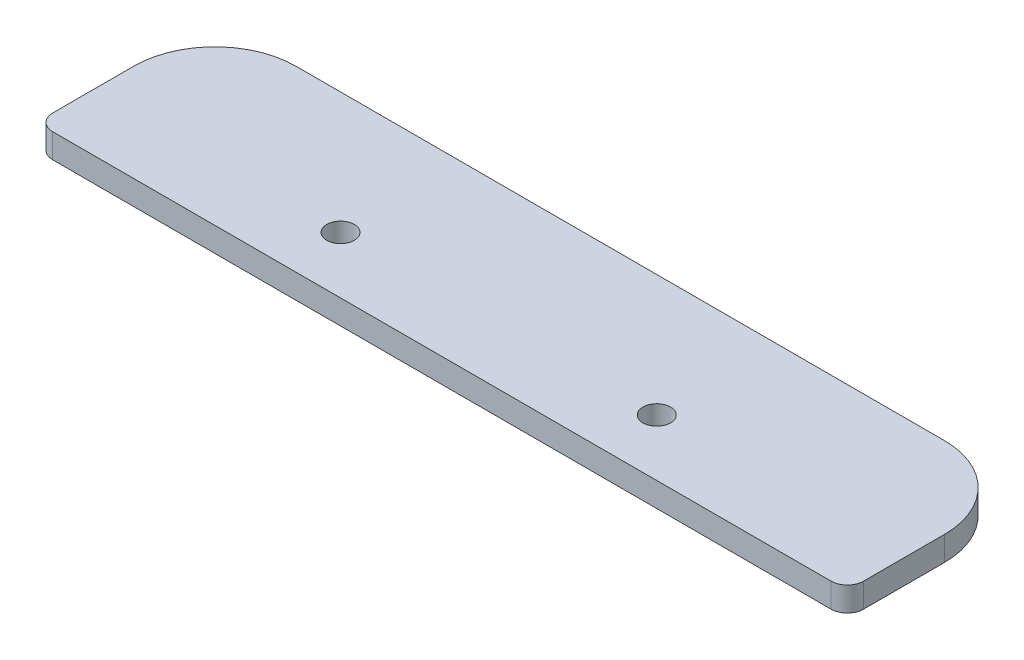
ISO-10303-21;
HEADER;
FILE_DESCRIPTION(('STEP AP214'),'2;1');
FILE_NAME('part.step','',(''),(''),'','','');
FILE_SCHEMA(('AUTOMOTIVE_DESIGN { 1 0 10303 214 1 1 1 1 }'));
ENDSEC;
DATA;
#1=APPLICATION_CONTEXT('core data for automotive mechanical design processes');
#2=APPLICATION_PROTOCOL_DEFINITION('international standard','automotive_design',2000,#1);
#3=PRODUCT_CONTEXT('',#1,'mechanical');
#4=PRODUCT('Part','Part','',(#3));
#5=PRODUCT_RELATED_PRODUCT_CATEGORY('part','',(#4));
#6=PRODUCT_DEFINITION_FORMATION('','',#4);
#7=PRODUCT_DEFINITION_CONTEXT('part definition',#1,'design');
#8=PRODUCT_DEFINITION('design','',#6,#7);
#9=PRODUCT_DEFINITION_SHAPE('','',#8);
#10=(LENGTH_UNIT() NAMED_UNIT(*) SI_UNIT(.MILLI.,.METRE.));
#11=(NAMED_UNIT(*) PLANE_ANGLE_UNIT() SI_UNIT($,.RADIAN.));
#12=(NAMED_UNIT(*) SI_UNIT($,.STERADIAN.) SOLID_ANGLE_UNIT());
#13=UNCERTAINTY_MEASURE_WITH_UNIT(LENGTH_MEASURE(1.E-05),#10,'distance_accuracy_value','');
#14=(GEOMETRIC_REPRESENTATION_CONTEXT(3) GLOBAL_UNCERTAINTY_ASSIGNED_CONTEXT((#13)) GLOBAL_UNIT_ASSIGNED_CONTEXT((#10,
#11,#12)) REPRESENTATION_CONTEXT('',''));
#15=CARTESIAN_POINT('',(0.,0.,0.));
#16=DIRECTION('',(0.,0.,1.));
#17=DIRECTION('',(1.,0.,0.));
#18=AXIS2_PLACEMENT_3D('',#15,#16,#17);
#19=CARTESIAN_POINT('',(-50.,15.,-50.));
#20=DIRECTION('',(1.,0.,0.));
#21=DIRECTION('',(0.,0.,-1.));
#22=AXIS2_PLACEMENT_3D('',#19,#20,#21);
#23=PLANE('',#22);
#24=DIRECTION('',(0.,0.,1.));
#25=VECTOR('',#24,1.);
#26=CARTESIAN_POINT('',(-50.,12.,-50.));
#27=LINE('',#26,#25);
#28=CARTESIAN_POINT('',(-50.,12.,-40.));
#29=VERTEX_POINT('',#28);
#30=CARTESIAN_POINT('',(-50.,12.,-30.));
#31=VERTEX_POINT('',#30);
#32=EDGE_CURVE('E119',#29,#31,#27,.T.);
#33=ORIENTED_EDGE('',*,*,#32,.T.);
#34=DIRECTION('',(0.,-1.,0.));
#35=VECTOR('',#34,1.);
#36=CARTESIAN_POINT('',(-50.,15.,-30.));
#37=LINE('',#36,#35);
#38=CARTESIAN_POINT('',(-50.,15.,-30.));
#39=VERTEX_POINT('',#38);
#40=EDGE_CURVE('E65',#31,#39,#37,.F.);
#41=ORIENTED_EDGE('',*,*,#40,.T.);
#42=DIRECTION('',(0.,0.,1.));
#43=VECTOR('',#42,1.);
#44=CARTESIAN_POINT('',(-50.,15.,-50.));
#45=LINE('',#44,#43);
#46=CARTESIAN_POINT('',(-50.,15.,-40.));
#47=VERTEX_POINT('',#46);
#48=EDGE_CURVE('E122',#47,#39,#45,.T.);
#49=ORIENTED_EDGE('',*,*,#48,.F.);
#50=DIRECTION('',(0.,-1.,0.));
#51=VECTOR('',#50,1.);
#52=CARTESIAN_POINT('',(-50.,15.,-40.));
#53=LINE('',#52,#51);
#54=EDGE_CURVE('E111',#47,#29,#53,.T.);
#55=ORIENTED_EDGE('',*,*,#54,.T.);
#56=EDGE_LOOP('',(#33,#41,#49,#55));
#57=FACE_BOUND('',#56,.T.);
#58=ADVANCED_FACE('F39',(#57),#23,.F.);
#59=CARTESIAN_POINT('',(-50.,15.,-28.));
#60=DIRECTION('',(0.,0.,-1.));
#61=DIRECTION('',(-1.,0.,0.));
#62=AXIS2_PLACEMENT_3D('',#59,#60,#61);
#63=PLANE('',#62);
#64=DIRECTION('',(1.,0.,0.));
#65=VECTOR('',#64,1.);
#66=CARTESIAN_POINT('',(-50.,15.,-28.));
#67=LINE('',#66,#65);
#68=CARTESIAN_POINT('',(-48.,15.,-28.));
#69=VERTEX_POINT('',#68);
#70=CARTESIAN_POINT('',(48.,15.,-28.));
#71=VERTEX_POINT('',#70);
#72=EDGE_CURVE('E168',#69,#71,#67,.T.);
#73=ORIENTED_EDGE('',*,*,#72,.F.);
#74=DIRECTION('',(0.,-1.,0.));
#75=VECTOR('',#74,1.);
#76=CARTESIAN_POINT('',(-48.,15.,-28.));
#77=LINE('',#76,#75);
#78=CARTESIAN_POINT('',(-48.,12.,-28.));
#79=VERTEX_POINT('',#78);
#80=EDGE_CURVE('E156',#69,#79,#77,.T.);
#81=ORIENTED_EDGE('',*,*,#80,.T.);
#82=DIRECTION('',(1.,0.,0.));
#83=VECTOR('',#82,1.);
#84=CARTESIAN_POINT('',(-50.,12.,-28.));
#85=LINE('',#84,#83);
#86=CARTESIAN_POINT('',(48.,12.,-28.));
#87=VERTEX_POINT('',#86);
#88=EDGE_CURVE('E130',#79,#87,#85,.T.);
#89=ORIENTED_EDGE('',*,*,#88,.T.);
#90=DIRECTION('',(0.,-1.,0.));
#91=VECTOR('',#90,1.);
#92=CARTESIAN_POINT('',(48.,15.,-28.));
#93=LINE('',#92,#91);
#94=EDGE_CURVE('E153',#87,#71,#93,.F.);
#95=ORIENTED_EDGE('',*,*,#94,.T.);
#96=EDGE_LOOP('',(#73,#81,#89,#95));
#97=FACE_BOUND('',#96,.T.);
#98=ADVANCED_FACE('F167',(#97),#63,.F.);
#99=CARTESIAN_POINT('',(50.,15.,-50.));
#100=DIRECTION('',(-1.,0.,0.));
#101=DIRECTION('',(0.,0.,1.));
#102=AXIS2_PLACEMENT_3D('',#99,#100,#101);
#103=PLANE('',#102);
#104=DIRECTION('',(0.,0.,-1.));
#105=VECTOR('',#104,1.);
#106=CARTESIAN_POINT('',(50.,15.,-50.));
#107=LINE('',#106,#105);
#108=CARTESIAN_POINT('',(50.,15.,-30.));
#109=VERTEX_POINT('',#108);
#110=CARTESIAN_POINT('',(50.,15.,-40.));
#111=VERTEX_POINT('',#110);
#112=EDGE_CURVE('E175',#109,#111,#107,.T.);
#113=ORIENTED_EDGE('',*,*,#112,.F.);
#114=DIRECTION('',(0.,-1.,0.));
#115=VECTOR('',#114,1.);
#116=CARTESIAN_POINT('',(50.,15.,-30.));
#117=LINE('',#116,#115);
#118=CARTESIAN_POINT('',(50.,12.,-30.));
#119=VERTEX_POINT('',#118);
#120=EDGE_CURVE('E11',#109,#119,#117,.T.);
#121=ORIENTED_EDGE('',*,*,#120,.T.);
#122=DIRECTION('',(0.,0.,-1.));
#123=VECTOR('',#122,1.);
#124=CARTESIAN_POINT('',(50.,12.,-50.));
#125=LINE('',#124,#123);
#126=CARTESIAN_POINT('',(50.,12.,-40.));
#127=VERTEX_POINT('',#126);
#128=EDGE_CURVE('E131',#119,#127,#125,.T.);
#129=ORIENTED_EDGE('',*,*,#128,.T.);
#130=DIRECTION('',(0.,-1.,0.));
#131=VECTOR('',#130,1.);
#132=CARTESIAN_POINT('',(50.,15.,-40.));
#133=LINE('',#132,#131);
#134=EDGE_CURVE('E151',#127,#111,#133,.F.);
#135=ORIENTED_EDGE('',*,*,#134,.T.);
#136=EDGE_LOOP('',(#113,#121,#129,#135));
#137=FACE_BOUND('',#136,.T.);
#138=ADVANCED_FACE('F188',(#137),#103,.F.);
#139=CARTESIAN_POINT('',(-50.,15.,-50.));
#140=DIRECTION('',(0.,0.,1.));
#141=DIRECTION('',(1.,0.,0.));
#142=AXIS2_PLACEMENT_3D('',#139,#140,#141);
#143=PLANE('',#142);
#144=DIRECTION('',(-1.,0.,0.));
#145=VECTOR('',#144,1.);
#146=CARTESIAN_POINT('',(-50.,12.,-50.));
#147=LINE('',#146,#145);
#148=CARTESIAN_POINT('',(40.,12.,-50.));
#149=VERTEX_POINT('',#148);
#150=CARTESIAN_POINT('',(-40.,12.,-50.));
#151=VERTEX_POINT('',#150);
#152=EDGE_CURVE('E140',#149,#151,#147,.T.);
#153=ORIENTED_EDGE('',*,*,#152,.T.);
#154=DIRECTION('',(0.,-1.,0.));
#155=VECTOR('',#154,1.);
#156=CARTESIAN_POINT('',(-40.,15.,-50.));
#157=LINE('',#156,#155);
#158=CARTESIAN_POINT('',(-40.,15.,-50.));
#159=VERTEX_POINT('',#158);
#160=EDGE_CURVE('E115',#151,#159,#157,.F.);
#161=ORIENTED_EDGE('',*,*,#160,.T.);
#162=DIRECTION('',(-1.,0.,0.));
#163=VECTOR('',#162,1.);
#164=CARTESIAN_POINT('',(-50.,15.,-50.));
#165=LINE('',#164,#163);
#166=CARTESIAN_POINT('',(40.,15.,-50.));
#167=VERTEX_POINT('',#166);
#168=EDGE_CURVE('E125',#167,#159,#165,.T.);
#169=ORIENTED_EDGE('',*,*,#168,.F.);
#170=DIRECTION('',(0.,-1.,0.));
#171=VECTOR('',#170,1.);
#172=CARTESIAN_POINT('',(40.,15.,-50.));
#173=LINE('',#172,#171);
#174=EDGE_CURVE('E120',#167,#149,#173,.T.);
#175=ORIENTED_EDGE('',*,*,#174,.T.);
#176=EDGE_LOOP('',(#153,#161,#169,#175));
#177=FACE_BOUND('',#176,.T.);
#178=ADVANCED_FACE('F215',(#177),#143,.F.);
#179=CARTESIAN_POINT('',(0.,15.,0.));
#180=DIRECTION('',(0.,1.,0.));
#181=DIRECTION('',(0.,0.,1.));
#182=AXIS2_PLACEMENT_3D('',#179,#180,#181);
#183=PLANE('',#182);
#184=CARTESIAN_POINT('',(-19.5,15.,-35.));
#185=DIRECTION('',(0.,1.,0.));
#186=DIRECTION('',(0.,0.,1.));
#187=AXIS2_PLACEMENT_3D('',#184,#185,#186);
#188=CIRCLE('',#187,1.7);
#189=CARTESIAN_POINT('',(-19.5,15.,-33.3));
#190=VERTEX_POINT('',#189);
#191=EDGE_CURVE('E133',#190,#190,#188,.T.);
#192=ORIENTED_EDGE('',*,*,#191,.F.);
#193=EDGE_LOOP('',(#192));
#194=FACE_BOUND('',#193,.T.);
#195=CARTESIAN_POINT('',(19.5,15.,-35.));
#196=DIRECTION('',(0.,1.,0.));
#197=DIRECTION('',(0.,0.,1.));
#198=AXIS2_PLACEMENT_3D('',#195,#196,#197);
#199=CIRCLE('',#198,1.7);
#200=CARTESIAN_POINT('',(19.5,15.,-33.3));
#201=VERTEX_POINT('',#200);
#202=EDGE_CURVE('E229',#201,#201,#199,.T.);
#203=ORIENTED_EDGE('',*,*,#202,.F.);
#204=EDGE_LOOP('',(#203));
#205=FACE_BOUND('',#204,.T.);
#206=ORIENTED_EDGE('',*,*,#48,.T.);
#207=CARTESIAN_POINT('',(-48.,15.,-30.));
#208=DIRECTION('',(0.,1.,0.));
#209=DIRECTION('',(0.,0.,1.));
#210=AXIS2_PLACEMENT_3D('',#207,#208,#209);
#211=CIRCLE('',#210,2.);
#212=EDGE_CURVE('E50',#39,#69,#211,.T.);
#213=ORIENTED_EDGE('',*,*,#212,.T.);
#214=ORIENTED_EDGE('',*,*,#72,.T.);
#215=CARTESIAN_POINT('',(48.,15.,-30.));
#216=DIRECTION('',(0.,1.,0.));
#217=DIRECTION('',(0.,0.,1.));
#218=AXIS2_PLACEMENT_3D('',#215,#216,#217);
#219=CIRCLE('',#218,2.);
#220=EDGE_CURVE('E53',#71,#109,#219,.T.);
#221=ORIENTED_EDGE('',*,*,#220,.T.);
#222=ORIENTED_EDGE('',*,*,#112,.T.);
#223=CARTESIAN_POINT('',(40.,15.,-40.));
#224=DIRECTION('',(0.,1.,0.));
#225=DIRECTION('',(0.,0.,1.));
#226=AXIS2_PLACEMENT_3D('',#223,#224,#225);
#227=CIRCLE('',#226,10.);
#228=EDGE_CURVE('E150',#111,#167,#227,.T.);
#229=ORIENTED_EDGE('',*,*,#228,.T.);
#230=ORIENTED_EDGE('',*,*,#168,.T.);
#231=CARTESIAN_POINT('',(-40.,15.,-40.));
#232=DIRECTION('',(0.,1.,0.));
#233=DIRECTION('',(0.,0.,1.));
#234=AXIS2_PLACEMENT_3D('',#231,#232,#233);
#235=CIRCLE('',#234,10.);
#236=EDGE_CURVE('E146',#159,#47,#235,.T.);
#237=ORIENTED_EDGE('',*,*,#236,.T.);
#238=EDGE_LOOP('',(#206,#213,#214,#221,#222,#229,#230,#237));
#239=FACE_BOUND('',#238,.T.);
#240=ADVANCED_FACE('F164',(#194,#205,#239),#183,.T.);
#241=CARTESIAN_POINT('',(0.,12.,0.));
#242=DIRECTION('',(0.,1.,0.));
#243=DIRECTION('',(0.,0.,1.));
#244=AXIS2_PLACEMENT_3D('',#241,#242,#243);
#245=PLANE('',#244);
#246=CARTESIAN_POINT('',(-19.5,12.,-35.));
#247=DIRECTION('',(0.,1.,0.));
#248=DIRECTION('',(0.,0.,1.));
#249=AXIS2_PLACEMENT_3D('',#246,#247,#248);
#250=CIRCLE('',#249,1.7);
#251=CARTESIAN_POINT('',(-19.5,12.,-33.3));
#252=VERTEX_POINT('',#251);
#253=EDGE_CURVE('E129',#252,#252,#250,.F.);
#254=ORIENTED_EDGE('',*,*,#253,.F.);
#255=EDGE_LOOP('',(#254));
#256=FACE_BOUND('',#255,.T.);
#257=CARTESIAN_POINT('',(19.5,12.,-35.));
#258=DIRECTION('',(0.,1.,0.));
#259=DIRECTION('',(0.,0.,1.));
#260=AXIS2_PLACEMENT_3D('',#257,#258,#259);
#261=CIRCLE('',#260,1.7);
#262=CARTESIAN_POINT('',(19.5,12.,-33.3));
#263=VERTEX_POINT('',#262);
#264=EDGE_CURVE('E231',#263,#263,#261,.F.);
#265=ORIENTED_EDGE('',*,*,#264,.F.);
#266=EDGE_LOOP('',(#265));
#267=FACE_BOUND('',#266,.T.);
#268=ORIENTED_EDGE('',*,*,#88,.F.);
#269=CARTESIAN_POINT('',(-48.,12.,-30.));
#270=DIRECTION('',(0.,1.,0.));
#271=DIRECTION('',(0.,0.,1.));
#272=AXIS2_PLACEMENT_3D('',#269,#270,#271);
#273=CIRCLE('',#272,2.);
#274=EDGE_CURVE('E127',#79,#31,#273,.F.);
#275=ORIENTED_EDGE('',*,*,#274,.T.);
#276=ORIENTED_EDGE('',*,*,#32,.F.);
#277=CARTESIAN_POINT('',(-40.,12.,-40.));
#278=DIRECTION('',(0.,1.,0.));
#279=DIRECTION('',(0.,0.,1.));
#280=AXIS2_PLACEMENT_3D('',#277,#278,#279);
#281=CIRCLE('',#280,10.);
#282=EDGE_CURVE('E110',#29,#151,#281,.F.);
#283=ORIENTED_EDGE('',*,*,#282,.T.);
#284=ORIENTED_EDGE('',*,*,#152,.F.);
#285=CARTESIAN_POINT('',(40.,12.,-40.));
#286=DIRECTION('',(0.,1.,0.));
#287=DIRECTION('',(0.,0.,1.));
#288=AXIS2_PLACEMENT_3D('',#285,#286,#287);
#289=CIRCLE('',#288,10.);
#290=EDGE_CURVE('E117',#149,#127,#289,.F.);
#291=ORIENTED_EDGE('',*,*,#290,.T.);
#292=ORIENTED_EDGE('',*,*,#128,.F.);
#293=CARTESIAN_POINT('',(48.,12.,-30.));
#294=DIRECTION('',(0.,1.,0.));
#295=DIRECTION('',(0.,0.,1.));
#296=AXIS2_PLACEMENT_3D('',#293,#294,#295);
#297=CIRCLE('',#296,2.);
#298=EDGE_CURVE('E158',#119,#87,#297,.F.);
#299=ORIENTED_EDGE('',*,*,#298,.T.);
#300=EDGE_LOOP('',(#268,#275,#276,#283,#284,#291,#292,#299));
#301=FACE_BOUND('',#300,.T.);
#302=ADVANCED_FACE('F123',(#256,#267,#301),#245,.F.);
#303=CARTESIAN_POINT('',(19.5,7.19167388793148,-35.));
#304=DIRECTION('',(0.,1.,0.));
#305=DIRECTION('',(0.,0.,1.));
#306=AXIS2_PLACEMENT_3D('',#303,#304,#305);
#307=CYLINDRICAL_SURFACE('',#306,1.7);
#308=ORIENTED_EDGE('',*,*,#264,.T.);
#309=EDGE_LOOP('',(#308));
#310=FACE_BOUND('',#309,.T.);
#311=ORIENTED_EDGE('',*,*,#202,.T.);
#312=EDGE_LOOP('',(#311));
#313=FACE_BOUND('',#312,.T.);
#314=ADVANCED_FACE('F200',(#310,#313),#307,.F.);
#315=CARTESIAN_POINT('',(-19.5,7.19167388793148,-35.));
#316=DIRECTION('',(0.,1.,0.));
#317=DIRECTION('',(0.,0.,1.));
#318=AXIS2_PLACEMENT_3D('',#315,#316,#317);
#319=CYLINDRICAL_SURFACE('',#318,1.7);
#320=ORIENTED_EDGE('',*,*,#253,.T.);
#321=EDGE_LOOP('',(#320));
#322=FACE_BOUND('',#321,.T.);
#323=ORIENTED_EDGE('',*,*,#191,.T.);
#324=EDGE_LOOP('',(#323));
#325=FACE_BOUND('',#324,.T.);
#326=ADVANCED_FACE('F193',(#322,#325),#319,.F.);
#327=CARTESIAN_POINT('',(-40.,15.,-40.));
#328=DIRECTION('',(0.,-1.,0.));
#329=DIRECTION('',(0.,0.,-1.));
#330=AXIS2_PLACEMENT_3D('',#327,#328,#329);
#331=CYLINDRICAL_SURFACE('',#330,10.);
#332=ORIENTED_EDGE('',*,*,#236,.F.);
#333=ORIENTED_EDGE('',*,*,#160,.F.);
#334=ORIENTED_EDGE('',*,*,#282,.F.);
#335=ORIENTED_EDGE('',*,*,#54,.F.);
#336=EDGE_LOOP('',(#332,#333,#334,#335));
#337=FACE_BOUND('',#336,.T.);
#338=ADVANCED_FACE('F109',(#337),#331,.T.);
#339=CARTESIAN_POINT('',(40.,15.,-40.));
#340=DIRECTION('',(0.,-1.,0.));
#341=DIRECTION('',(0.,0.,-1.));
#342=AXIS2_PLACEMENT_3D('',#339,#340,#341);
#343=CYLINDRICAL_SURFACE('',#342,10.);
#344=ORIENTED_EDGE('',*,*,#228,.F.);
#345=ORIENTED_EDGE('',*,*,#134,.F.);
#346=ORIENTED_EDGE('',*,*,#290,.F.);
#347=ORIENTED_EDGE('',*,*,#174,.F.);
#348=EDGE_LOOP('',(#344,#345,#346,#347));
#349=FACE_BOUND('',#348,.T.);
#350=ADVANCED_FACE('F176',(#349),#343,.T.);
#351=CARTESIAN_POINT('',(-48.,15.,-30.));
#352=DIRECTION('',(0.,-1.,0.));
#353=DIRECTION('',(0.,0.,-1.));
#354=AXIS2_PLACEMENT_3D('',#351,#352,#353);
#355=CYLINDRICAL_SURFACE('',#354,2.);
#356=ORIENTED_EDGE('',*,*,#212,.F.);
#357=ORIENTED_EDGE('',*,*,#40,.F.);
#358=ORIENTED_EDGE('',*,*,#274,.F.);
#359=ORIENTED_EDGE('',*,*,#80,.F.);
#360=EDGE_LOOP('',(#356,#357,#358,#359));
#361=FACE_BOUND('',#360,.T.);
#362=ADVANCED_FACE('F172',(#361),#355,.T.);
#363=CARTESIAN_POINT('',(48.,15.,-30.));
#364=DIRECTION('',(0.,-1.,0.));
#365=DIRECTION('',(0.,0.,-1.));
#366=AXIS2_PLACEMENT_3D('',#363,#364,#365);
#367=CYLINDRICAL_SURFACE('',#366,2.);
#368=ORIENTED_EDGE('',*,*,#220,.F.);
#369=ORIENTED_EDGE('',*,*,#94,.F.);
#370=ORIENTED_EDGE('',*,*,#298,.F.);
#371=ORIENTED_EDGE('',*,*,#120,.F.);
#372=EDGE_LOOP('',(#368,#369,#370,#371));
#373=FACE_BOUND('',#372,.T.);
#374=ADVANCED_FACE('F41',(#373),#367,.T.);
#375=CLOSED_SHELL('',(#58,#98,#138,#178,#240,#302,#314,#326,#338,#350,#362,#374));
#376=MANIFOLD_SOLID_BREP('B2',#375);
#377=ADVANCED_BREP_SHAPE_REPRESENTATION('',(#18,#376),#14);
#378=SHAPE_DEFINITION_REPRESENTATION(#9,#377);
ENDSEC;
END-ISO-10303-21;
